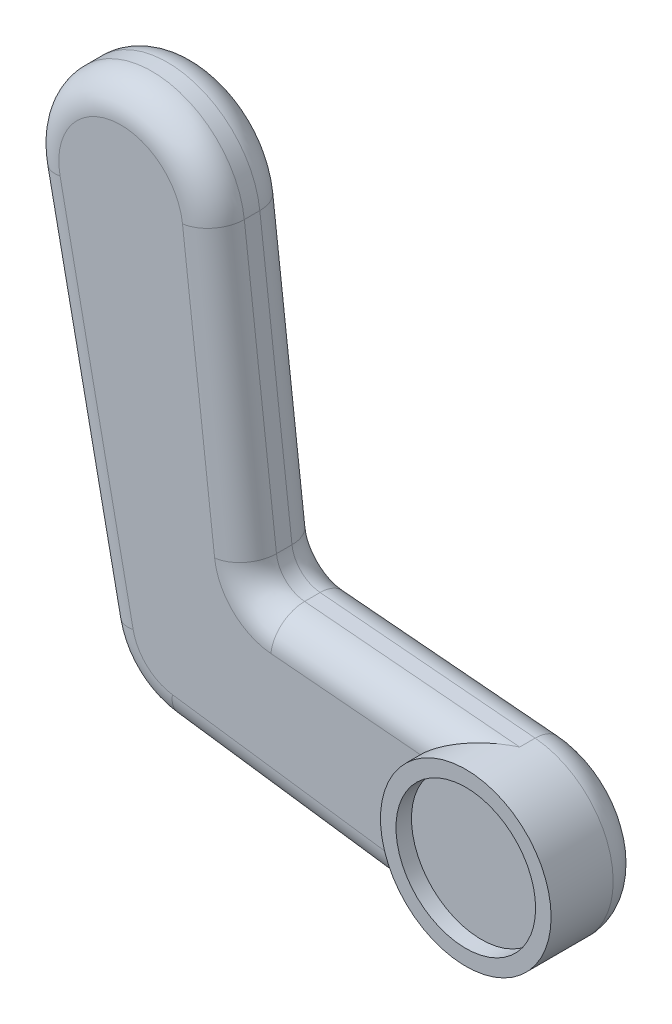
ISO-10303-21;
HEADER;
FILE_DESCRIPTION(('STEP AP214'),'2;1');
FILE_NAME('part.step','',(''),(''),'','','');
FILE_SCHEMA(('AUTOMOTIVE_DESIGN { 1 0 10303 214 1 1 1 1 }'));
ENDSEC;
DATA;
#1=APPLICATION_CONTEXT('core data for automotive mechanical design processes');
#2=APPLICATION_PROTOCOL_DEFINITION('international standard','automotive_design',2000,#1);
#3=PRODUCT_CONTEXT('',#1,'mechanical');
#4=PRODUCT('Part','Part','',(#3));
#5=PRODUCT_RELATED_PRODUCT_CATEGORY('part','',(#4));
#6=PRODUCT_DEFINITION_FORMATION('','',#4);
#7=PRODUCT_DEFINITION_CONTEXT('part definition',#1,'design');
#8=PRODUCT_DEFINITION('design','',#6,#7);
#9=PRODUCT_DEFINITION_SHAPE('','',#8);
#10=(LENGTH_UNIT() NAMED_UNIT(*) SI_UNIT(.MILLI.,.METRE.));
#11=(NAMED_UNIT(*) PLANE_ANGLE_UNIT() SI_UNIT($,.RADIAN.));
#12=(NAMED_UNIT(*) SI_UNIT($,.STERADIAN.) SOLID_ANGLE_UNIT());
#13=UNCERTAINTY_MEASURE_WITH_UNIT(LENGTH_MEASURE(1.E-05),#10,'distance_accuracy_value','');
#14=(GEOMETRIC_REPRESENTATION_CONTEXT(3) GLOBAL_UNCERTAINTY_ASSIGNED_CONTEXT((#13)) GLOBAL_UNIT_ASSIGNED_CONTEXT((#10,
#11,#12)) REPRESENTATION_CONTEXT('',''));
#15=CARTESIAN_POINT('',(0.,0.,0.));
#16=DIRECTION('',(0.,0.,1.));
#17=DIRECTION('',(1.,0.,0.));
#18=AXIS2_PLACEMENT_3D('',#15,#16,#17);
#19=CARTESIAN_POINT('',(0.,0.,5.));
#20=DIRECTION('',(0.,0.,1.));
#21=DIRECTION('',(1.,0.,0.));
#22=AXIS2_PLACEMENT_3D('',#19,#20,#21);
#23=PLANE('',#22);
#24=CARTESIAN_POINT('',(0.,0.,5.));
#25=DIRECTION('',(0.,0.,1.));
#26=DIRECTION('',(1.,0.,0.));
#27=AXIS2_PLACEMENT_3D('',#24,#25,#26);
#28=CIRCLE('',#27,27.5);
#29=CARTESIAN_POINT('',(27.5,0.,5.));
#30=VERTEX_POINT('',#29);
#31=EDGE_CURVE('E202',#30,#30,#28,.T.);
#32=ORIENTED_EDGE('',*,*,#31,.T.);
#33=EDGE_LOOP('',(#32));
#34=FACE_BOUND('',#33,.T.);
#35=CARTESIAN_POINT('',(0.,0.,5.));
#36=DIRECTION('',(0.,0.,1.));
#37=DIRECTION('',(1.,0.,0.));
#38=AXIS2_PLACEMENT_3D('',#35,#36,#37);
#39=CIRCLE('',#38,22.5);
#40=CARTESIAN_POINT('',(22.5,0.,5.));
#41=VERTEX_POINT('',#40);
#42=EDGE_CURVE('E410',#41,#41,#39,.T.);
#43=ORIENTED_EDGE('',*,*,#42,.F.);
#44=EDGE_LOOP('',(#43));
#45=FACE_BOUND('',#44,.T.);
#46=ADVANCED_FACE('F43',(#34,#45),#23,.T.);
#47=CARTESIAN_POINT('',(0.,0.,5.));
#48=DIRECTION('',(0.,0.,-1.));
#49=DIRECTION('',(-1.,0.,0.));
#50=AXIS2_PLACEMENT_3D('',#47,#48,#49);
#51=CYLINDRICAL_SURFACE('',#50,27.5);
#52=ORIENTED_EDGE('',*,*,#31,.F.);
#53=EDGE_LOOP('',(#52));
#54=FACE_BOUND('',#53,.T.);
#55=DIRECTION('',(0.,0.,1.));
#56=VECTOR('',#55,1.);
#57=CARTESIAN_POINT('',(-3.75752842126835,-27.2420810541956,-25.));
#58=LINE('',#57,#56);
#59=CARTESIAN_POINT('',(-3.75752842126835,-27.2420810541956,-15.));
#60=VERTEX_POINT('',#59);
#61=CARTESIAN_POINT('',(-3.75752842126835,-27.2420810541956,-10.));
#62=VERTEX_POINT('',#61);
#63=EDGE_CURVE('E167',#60,#62,#58,.T.);
#64=ORIENTED_EDGE('',*,*,#63,.F.);
#65=CARTESIAN_POINT('',(0.,0.,-15.));
#66=DIRECTION('',(0.,0.,-1.));
#67=DIRECTION('',(-1.,0.,0.));
#68=AXIS2_PLACEMENT_3D('',#65,#66,#67);
#69=CIRCLE('',#68,27.5);
#70=CARTESIAN_POINT('',(2.36498786594932,27.3981173147702,-15.));
#71=VERTEX_POINT('',#70);
#72=EDGE_CURVE('E161',#60,#71,#69,.F.);
#73=ORIENTED_EDGE('',*,*,#72,.T.);
#74=DIRECTION('',(0.,0.,1.));
#75=VECTOR('',#74,1.);
#76=CARTESIAN_POINT('',(2.36498786594932,27.3981173147702,-25.));
#77=LINE('',#76,#75);
#78=CARTESIAN_POINT('',(2.36498786594932,27.3981173147702,-10.));
#79=VERTEX_POINT('',#78);
#80=EDGE_CURVE('E164',#71,#79,#77,.T.);
#81=ORIENTED_EDGE('',*,*,#80,.T.);
#82=CARTESIAN_POINT('',(-19.629619952598,19.2594916993302,0.));
#83=CARTESIAN_POINT('',(-19.4804950674792,19.4114863193802,-2.58608033136355E-06));
#84=CARTESIAN_POINT('',(-19.3296273937898,19.56171758312,-0.00404677025793204));
#85=CARTESIAN_POINT('',(-19.0246798710638,19.8584183152351,-0.0197641265848312));
#86=CARTESIAN_POINT('',(-18.8706006597675,20.0048885178204,-0.0314357977963182));
#87=CARTESIAN_POINT('',(-18.4043644922104,20.4379312799549,-0.0771646805695516));
#88=CARTESIAN_POINT('',(-18.0877302525504,20.7186236464207,-0.121938707129456));
#89=CARTESIAN_POINT('',(-17.4473044336781,21.2606726824992,-0.236170046446091));
#90=CARTESIAN_POINT('',(-17.1235936997473,21.5221700592405,-0.305420169175692));
#91=CARTESIAN_POINT('',(-16.4679549333872,22.0278914852391,-0.465654643117525));
#92=CARTESIAN_POINT('',(-16.1360226259963,22.2721062822743,-0.556650523519821));
#93=CARTESIAN_POINT('',(-15.2841060452578,22.870162939583,-0.811975419196419));
#94=CARTESIAN_POINT('',(-14.7594796373689,23.2118868921289,-0.989353157852216));
#95=CARTESIAN_POINT('',(-13.6984386486137,23.8534600956564,-1.38060895620895));
#96=CARTESIAN_POINT('',(-13.1620201189021,24.1532950641622,-1.59449941032993));
#97=CARTESIAN_POINT('',(-12.0774864503665,24.7135374486886,-2.05312754597173));
#98=CARTESIAN_POINT('',(-11.5293218704649,24.9737088555077,-2.29803512167089));
#99=CARTESIAN_POINT('',(-10.4268344645309,25.4537360430249,-2.81192100432477));
#100=CARTESIAN_POINT('',(-9.87251169094569,25.6735921667954,-3.08089910641672));
#101=CARTESIAN_POINT('',(-8.52623403387546,26.1583250712659,-3.75502093616513));
#102=CARTESIAN_POINT('',(-7.73204755164753,26.4034558146742,-4.16998860381811));
#103=CARTESIAN_POINT('',(-6.13903521035468,26.8186548479547,-5.02802397004821));
#104=CARTESIAN_POINT('',(-5.3402071896426,26.9886847502639,-5.47110590712535));
#105=CARTESIAN_POINT('',(-3.74323211837709,27.2560489443915,-6.37551216845542));
#106=CARTESIAN_POINT('',(-2.94508745977645,27.3535429453934,-6.83679404601559));
#107=CARTESIAN_POINT('',(-1.35072163006649,27.4784369985454,-7.77103237080087));
#108=CARTESIAN_POINT('',(-0.554499618344122,27.5058772178246,-8.24398197088864));
#109=CARTESIAN_POINT('',(0.590107112149595,27.4959013299018,-8.92945263839693));
#110=CARTESIAN_POINT('',(0.940204868909162,27.4861517302499,-9.13987240391389));
#111=CARTESIAN_POINT('',(1.63929848220274,27.453325537943,-9.56115651079276));
#112=CARTESIAN_POINT('',(1.9882948258813,27.4302560383681,-9.77202055606842));
#113=CARTESIAN_POINT('',(2.34612302972221,27.3997408078832,-9.98858202775663));
#114=CARTESIAN_POINT('',(2.35555566963984,27.3989314954957,-9.99429102099557));
#115=CARTESIAN_POINT('',(2.36498786594932,27.3981173147702,-10.));
#116=B_SPLINE_CURVE_WITH_KNOTS('',3,(#82,#83,#84,#85,#86,#87,#88,#89,#90,#91,#92,#93,#94,#95,
#96,#97,#98,#99,#100,#101,#102,#103,#104,#105,#106,#107,#108,#109,#110,#111,#112,#113,#114,
#115),.UNSPECIFIED.,.F.,.F.,(4,2,2,2,2,2,2,2,2,2,2,2,2,2,2,2,4),(0.,0.638680835833969,
1.27723602980536,2.55230274418055,3.81682480604324,5.08201878684361,7.03126612892686,
8.98117647313759,10.9422709427457,12.9033487231864,15.6862805099955,18.4706331422623,
21.2488369093158,24.0254473639889,25.2510396575953,26.475979902987,26.5091461541338),.UNSPECIFIED.);
#117=CARTESIAN_POINT('',(-19.629619952598,19.2594916993302,0.));
#118=VERTEX_POINT('',#117);
#119=EDGE_CURVE('E11',#79,#118,#116,.F.);
#120=ORIENTED_EDGE('',*,*,#119,.T.);
#121=CARTESIAN_POINT('',(0.,0.,0.));
#122=DIRECTION('',(0.,0.,1.));
#123=DIRECTION('',(1.,0.,0.));
#124=AXIS2_PLACEMENT_3D('',#121,#122,#123);
#125=CIRCLE('',#124,27.5);
#126=CARTESIAN_POINT('',(-23.4054019921401,-14.4373528593826,0.));
#127=VERTEX_POINT('',#126);
#128=EDGE_CURVE('E413',#118,#127,#125,.T.);
#129=ORIENTED_EDGE('',*,*,#128,.T.);
#130=CARTESIAN_POINT('',(-23.4054019921401,-14.4373528593826,0.));
#131=CARTESIAN_POINT('',(-23.2936154416342,-14.6185829976378,-2.58608033261556E-06));
#132=CARTESIAN_POINT('',(-23.1797390498459,-14.7984792315138,-0.00404677025794965));
#133=CARTESIAN_POINT('',(-22.9480211757239,-15.1553141273235,-0.0197641265849107));
#134=CARTESIAN_POINT('',(-22.8301804778133,-15.3322533641116,-0.0314357977964434));
#135=CARTESIAN_POINT('',(-22.4713496547863,-15.8577461216477,-0.0771646805698546));
#136=CARTESIAN_POINT('',(-22.2246918527838,-16.201556207348,-0.121938707129933));
#137=CARTESIAN_POINT('',(-21.7201169522785,-16.8719042936225,-0.236170046446767));
#138=CARTESIAN_POINT('',(-21.462309836005,-17.1985616188161,-0.305420169176294));
#139=CARTESIAN_POINT('',(-20.9348590868465,-17.8368500018198,-0.46565464311789));
#140=CARTESIAN_POINT('',(-20.6652092372773,-18.1484729830125,-0.556650523520024));
#141=CARTESIAN_POINT('',(-19.9667843229935,-18.9202477331779,-0.811975419196239));
#142=CARTESIAN_POINT('',(-19.5308002615594,-19.3696095314791,-0.989353157851801));
#143=CARTESIAN_POINT('',(-18.6380684257909,-20.230105914217,-1.38060895620798));
#144=CARTESIAN_POINT('',(-18.1813136394846,-20.6412274443541,-1.59449941032864));
#145=CARTESIAN_POINT('',(-17.2476712602921,-21.4276094859743,-2.05312754597027));
#146=CARTESIAN_POINT('',(-16.7706832179142,-21.8026507837193,-2.29803512166965));
#147=CARTESIAN_POINT('',(-15.8017787876449,-22.5147805373504,-2.81192100432412));
#148=CARTESIAN_POINT('',(-15.3098625268302,-22.8518693161929,-3.08089910641645));
#149=CARTESIAN_POINT('',(-14.1042552604534,-23.622544758819,-3.75502093616537));
#150=CARTESIAN_POINT('',(-13.3840177240302,-24.0373689879161,-4.16998860381835));
#151=CARTESIAN_POINT('',(-11.9224051950821,-24.7948433254172,-5.02802397005016));
#152=CARTESIAN_POINT('',(-11.1810195984231,-25.1374564766831,-5.471105907129));
#153=CARTESIAN_POINT('',(-9.68282319250998,-25.7516392832319,-6.37551216845531));
#154=CARTESIAN_POINT('',(-8.92605006338966,-26.023364157561,-6.83679404600999));
#155=CARTESIAN_POINT('',(-7.39886610641632,-26.4980325523295,-7.77103237080849));
#156=CARTESIAN_POINT('',(-6.62846334875328,-26.701015429813,-8.24398197091494));
#157=CARTESIAN_POINT('',(-5.51003462187162,-26.9446160635711,-8.92945263838555));
#158=CARTESIAN_POINT('',(-5.16646136405255,-27.012593342875,-9.13987240388232));
#159=CARTESIAN_POINT('',(-4.47743983637665,-27.1353075368178,-9.56115651082458));
#160=CARTESIAN_POINT('',(-4.13199266132626,-27.1900514764474,-9.77202055618375));
#161=CARTESIAN_POINT('',(-3.77628473338466,-27.2394890411362,-9.98858202776281));
#162=CARTESIAN_POINT('',(-3.76690689976356,-27.2407874705588,-9.99429102099873));
#163=CARTESIAN_POINT('',(-3.75752842126835,-27.2420810541955,-10.));
#164=B_SPLINE_CURVE_WITH_KNOTS('',3,(#130,#131,#132,#133,#134,#135,#136,#137,#138,#139,#140,
#141,#142,#143,#144,#145,#146,#147,#148,#149,#150,#151,#152,#153,#154,#155,#156,#157,#158,#159,
#160,#161,#162,#163),.UNSPECIFIED.,.F.,.F.,(4,2,2,2,2,2,2,2,2,2,2,2,2,2,2,2,4),(0.,
0.638680835835257,1.27723602980794,2.55230274418566,3.81682480604578,5.08201878684361,
7.03126612892458,8.98117647313294,10.9422709427432,12.9033487231863,15.686280509998,
18.4706331422666,21.2488369093176,24.0254473639888,25.2510396575952,26.4759799029871,
26.5091461541338),.UNSPECIFIED.);
#165=EDGE_CURVE('E53',#127,#62,#164,.T.);
#166=ORIENTED_EDGE('',*,*,#165,.T.);
#167=EDGE_LOOP('',(#64,#73,#81,#120,#129,#166));
#168=FACE_BOUND('',#167,.T.);
#169=ADVANCED_FACE('F163',(#54,#168),#51,.T.);
#170=CARTESIAN_POINT('',(0.,0.,5.));
#171=DIRECTION('',(0.,0.,-1.));
#172=DIRECTION('',(-1.,0.,0.));
#173=AXIS2_PLACEMENT_3D('',#170,#171,#172);
#174=CYLINDRICAL_SURFACE('',#173,22.5);
#175=ORIENTED_EDGE('',*,*,#42,.T.);
#176=EDGE_LOOP('',(#175));
#177=FACE_BOUND('',#176,.T.);
#178=CARTESIAN_POINT('',(0.,0.,0.));
#179=DIRECTION('',(0.,0.,1.));
#180=DIRECTION('',(1.,0.,0.));
#181=AXIS2_PLACEMENT_3D('',#178,#179,#180);
#182=CIRCLE('',#181,22.5);
#183=CARTESIAN_POINT('',(22.5,0.,0.));
#184=VERTEX_POINT('',#183);
#185=EDGE_CURVE('E409',#184,#184,#182,.T.);
#186=ORIENTED_EDGE('',*,*,#185,.F.);
#187=EDGE_LOOP('',(#186));
#188=FACE_BOUND('',#187,.T.);
#189=ADVANCED_FACE('F325',(#177,#188),#174,.F.);
#190=CARTESIAN_POINT('',(0.,0.,0.));
#191=DIRECTION('',(0.,0.,-1.));
#192=DIRECTION('',(-1.,0.,0.));
#193=AXIS2_PLACEMENT_3D('',#190,#191,#192);
#194=PLANE('',#193);
#195=ORIENTED_EDGE('',*,*,#185,.T.);
#196=EDGE_LOOP('',(#195));
#197=FACE_BOUND('',#196,.T.);
#198=ADVANCED_FACE('F332',(#197),#194,.F.);
#199=CARTESIAN_POINT('',(-115.920026502103,-23.7730817951904,-25.));
#200=DIRECTION('',(-0.979611657872959,-0.200900472272695,0.));
#201=DIRECTION('',(0.200900472272695,-0.979611657872959,0.));
#202=AXIS2_PLACEMENT_3D('',#199,#200,#201);
#203=PLANE('',#202);
#204=DIRECTION('',(0.,0.,1.));
#205=VECTOR('',#204,1.);
#206=CARTESIAN_POINT('',(-122.006316958186,5.90430530366279,-25.));
#207=LINE('',#206,#205);
#208=CARTESIAN_POINT('',(-122.006316958186,5.90430530366279,-15.));
#209=VERTEX_POINT('',#208);
#210=CARTESIAN_POINT('',(-122.006316958186,5.90430530366279,-10.));
#211=VERTEX_POINT('',#210);
#212=EDGE_CURVE('E249',#209,#211,#207,.T.);
#213=ORIENTED_EDGE('',*,*,#212,.T.);
#214=DIRECTION('',(0.200900472272695,-0.979611657872959,0.));
#215=VECTOR('',#214,1.);
#216=CARTESIAN_POINT('',(-145.558232534352,120.745902252901,-10.));
#217=LINE('',#216,#215);
#218=CARTESIAN_POINT('',(-145.558232534352,120.745902252901,-10.));
#219=VERTEX_POINT('',#218);
#220=EDGE_CURVE('E272',#211,#219,#217,.F.);
#221=ORIENTED_EDGE('',*,*,#220,.T.);
#222=DIRECTION('',(0.,0.,1.));
#223=VECTOR('',#222,1.);
#224=CARTESIAN_POINT('',(-145.558232534352,120.745902252901,-25.));
#225=LINE('',#224,#223);
#226=CARTESIAN_POINT('',(-145.558232534352,120.745902252901,-15.));
#227=VERTEX_POINT('',#226);
#228=EDGE_CURVE('E406',#227,#219,#225,.T.);
#229=ORIENTED_EDGE('',*,*,#228,.F.);
#230=DIRECTION('',(0.200900472272695,-0.979611657872959,0.));
#231=VECTOR('',#230,1.);
#232=CARTESIAN_POINT('',(-115.920026502103,-23.7730817951904,-15.));
#233=LINE('',#232,#231);
#234=EDGE_CURVE('E223',#227,#209,#233,.T.);
#235=ORIENTED_EDGE('',*,*,#234,.T.);
#236=EDGE_LOOP('',(#213,#221,#229,#235));
#237=FACE_BOUND('',#236,.T.);
#238=ADVANCED_FACE('F334',(#237),#203,.T.);
#239=CARTESIAN_POINT('',(-116.169882798164,126.772916421082,-25.));
#240=DIRECTION('',(0.,0.,1.));
#241=DIRECTION('',(1.,0.,0.));
#242=AXIS2_PLACEMENT_3D('',#239,#240,#241);
#243=CYLINDRICAL_SURFACE('',#242,30.);
#244=ORIENTED_EDGE('',*,*,#228,.T.);
#245=CARTESIAN_POINT('',(-116.169882798164,126.772916421082,-10.));
#246=DIRECTION('',(0.,0.,-1.));
#247=DIRECTION('',(-1.,0.,0.));
#248=AXIS2_PLACEMENT_3D('',#245,#246,#247);
#249=CIRCLE('',#248,30.);
#250=CARTESIAN_POINT('',(-86.3750803237855,130.275736072847,-10.));
#251=VERTEX_POINT('',#250);
#252=EDGE_CURVE('E268',#219,#251,#249,.T.);
#253=ORIENTED_EDGE('',*,*,#252,.T.);
#254=DIRECTION('',(0.,0.,1.));
#255=VECTOR('',#254,1.);
#256=CARTESIAN_POINT('',(-86.3750803237855,130.275736072847,-25.));
#257=LINE('',#256,#255);
#258=CARTESIAN_POINT('',(-86.3750803237855,130.275736072847,-15.));
#259=VERTEX_POINT('',#258);
#260=EDGE_CURVE('E182',#259,#251,#257,.T.);
#261=ORIENTED_EDGE('',*,*,#260,.F.);
#262=CARTESIAN_POINT('',(-116.169882798164,126.772916421082,-15.));
#263=DIRECTION('',(0.,0.,-1.));
#264=DIRECTION('',(-1.,0.,0.));
#265=AXIS2_PLACEMENT_3D('',#262,#263,#264);
#266=CIRCLE('',#265,30.);
#267=EDGE_CURVE('E221',#259,#227,#266,.F.);
#268=ORIENTED_EDGE('',*,*,#267,.T.);
#269=EDGE_LOOP('',(#244,#253,#261,#268));
#270=FACE_BOUND('',#269,.T.);
#271=ADVANCED_FACE('F337',(#270),#243,.T.);
#272=CARTESIAN_POINT('',(-70.0904867381572,-8.2401732503285,-25.));
#273=DIRECTION('',(-0.993160082479271,-0.116760655058834,0.));
#274=DIRECTION('',(0.116760655058834,-0.993160082479271,0.));
#275=AXIS2_PLACEMENT_3D('',#272,#273,#274);
#276=PLANE('',#275);
#277=ORIENTED_EDGE('',*,*,#260,.T.);
#278=DIRECTION('',(0.116760655058834,-0.993160082479271,0.));
#279=VECTOR('',#278,1.);
#280=CARTESIAN_POINT('',(-70.0904867381572,-8.2401732503285,-10.));
#281=LINE('',#280,#279);
#282=CARTESIAN_POINT('',(-76.0176946469568,42.176350129136,-10.));
#283=VERTEX_POINT('',#282);
#284=EDGE_CURVE('E61',#251,#283,#281,.T.);
#285=ORIENTED_EDGE('',*,*,#284,.T.);
#286=DIRECTION('',(0.,0.,1.));
#287=VECTOR('',#286,1.);
#288=CARTESIAN_POINT('',(-76.0176946469568,42.176350129136,-25.));
#289=LINE('',#288,#287);
#290=CARTESIAN_POINT('',(-76.0176946469568,42.176350129136,-15.));
#291=VERTEX_POINT('',#290);
#292=EDGE_CURVE('E225',#283,#291,#289,.F.);
#293=ORIENTED_EDGE('',*,*,#292,.T.);
#294=DIRECTION('',(0.116760655058834,-0.993160082479271,0.));
#295=VECTOR('',#294,1.);
#296=CARTESIAN_POINT('',(-86.3750803237855,130.275736072847,-15.));
#297=LINE('',#296,#295);
#298=EDGE_CURVE('E227',#291,#259,#297,.F.);
#299=ORIENTED_EDGE('',*,*,#298,.T.);
#300=EDGE_LOOP('',(#277,#285,#293,#299));
#301=FACE_BOUND('',#300,.T.);
#302=ADVANCED_FACE('F341',(#301),#276,.F.);
#303=CARTESIAN_POINT('',(2.36498786594932,27.3981173147702,-25.));
#304=DIRECTION('',(0.0859995587617934,0.996295175082554,0.));
#305=DIRECTION('',(-0.996295175082554,0.0859995587617934,0.));
#306=AXIS2_PLACEMENT_3D('',#303,#304,#305);
#307=PLANE('',#306);
#308=DIRECTION('',(0.,0.,1.));
#309=VECTOR('',#308,1.);
#310=CARTESIAN_POINT('',(-66.9460894097821,33.3810049288988,-25.));
#311=LINE('',#310,#309);
#312=CARTESIAN_POINT('',(-66.9460894097821,33.3810049288988,-15.));
#313=VERTEX_POINT('',#312);
#314=CARTESIAN_POINT('',(-66.9460894097821,33.3810049288988,-10.));
#315=VERTEX_POINT('',#314);
#316=EDGE_CURVE('E197',#313,#315,#311,.T.);
#317=ORIENTED_EDGE('',*,*,#316,.T.);
#318=DIRECTION('',(-0.996295175082554,0.0859995587617934,0.));
#319=VECTOR('',#318,1.);
#320=CARTESIAN_POINT('',(2.36498786594932,27.3981173147702,-10.));
#321=LINE('',#320,#319);
#322=EDGE_CURVE('E181',#315,#79,#321,.F.);
#323=ORIENTED_EDGE('',*,*,#322,.T.);
#324=ORIENTED_EDGE('',*,*,#80,.F.);
#325=DIRECTION('',(-0.996295175082554,0.0859995587617934,0.));
#326=VECTOR('',#325,1.);
#327=CARTESIAN_POINT('',(2.36498786594932,27.3981173147702,-15.));
#328=LINE('',#327,#326);
#329=EDGE_CURVE('E179',#71,#313,#328,.T.);
#330=ORIENTED_EDGE('',*,*,#329,.T.);
#331=EDGE_LOOP('',(#317,#323,#324,#330));
#332=FACE_BOUND('',#331,.T.);
#333=ADVANCED_FACE('F177',(#332),#307,.T.);
#334=CARTESIAN_POINT('',(-3.75752842126835,-27.2420810541955,-25.));
#335=DIRECTION('',(0.136637397137031,0.990621129243475,0.));
#336=DIRECTION('',(-0.990621129243475,0.136637397137031,0.));
#337=AXIS2_PLACEMENT_3D('',#334,#335,#336);
#338=PLANE('',#337);
#339=ORIENTED_EDGE('',*,*,#63,.T.);
#340=DIRECTION('',(-0.990621129243475,0.136637397137031,0.));
#341=VECTOR('',#340,1.);
#342=CARTESIAN_POINT('',(-3.75752842126835,-27.2420810541955,-10.));
#343=LINE('',#342,#341);
#344=CARTESIAN_POINT('',(-100.931960439788,-13.8387111206067,-10.));
#345=VERTEX_POINT('',#344);
#346=EDGE_CURVE('E229',#62,#345,#343,.T.);
#347=ORIENTED_EDGE('',*,*,#346,.T.);
#348=DIRECTION('',(0.,0.,1.));
#349=VECTOR('',#348,1.);
#350=CARTESIAN_POINT('',(-100.931960439788,-13.8387111206067,-25.));
#351=LINE('',#350,#349);
#352=CARTESIAN_POINT('',(-100.931960439788,-13.8387111206067,-15.));
#353=VERTEX_POINT('',#352);
#354=EDGE_CURVE('E398',#353,#345,#351,.T.);
#355=ORIENTED_EDGE('',*,*,#354,.F.);
#356=DIRECTION('',(-0.990621129243475,0.136637397137031,0.));
#357=VECTOR('',#356,1.);
#358=CARTESIAN_POINT('',(-3.75752842126835,-27.2420810541955,-15.));
#359=LINE('',#358,#357);
#360=EDGE_CURVE('E172',#353,#60,#359,.F.);
#361=ORIENTED_EDGE('',*,*,#360,.T.);
#362=EDGE_LOOP('',(#339,#347,#355,#361));
#363=FACE_BOUND('',#362,.T.);
#364=ADVANCED_FACE('F347',(#363),#338,.F.);
#365=CARTESIAN_POINT('',(-97.5160255113618,10.9268171104802,-25.));
#366=DIRECTION('',(0.,0.,1.));
#367=DIRECTION('',(1.,0.,0.));
#368=AXIS2_PLACEMENT_3D('',#365,#366,#367);
#369=CYLINDRICAL_SURFACE('',#368,25.);
#370=ORIENTED_EDGE('',*,*,#354,.T.);
#371=CARTESIAN_POINT('',(-97.5160255113618,10.9268171104802,-10.));
#372=DIRECTION('',(0.,0.,-1.));
#373=DIRECTION('',(-1.,0.,0.));
#374=AXIS2_PLACEMENT_3D('',#371,#372,#373);
#375=CIRCLE('',#374,25.);
#376=EDGE_CURVE('E266',#345,#211,#375,.T.);
#377=ORIENTED_EDGE('',*,*,#376,.T.);
#378=ORIENTED_EDGE('',*,*,#212,.F.);
#379=CARTESIAN_POINT('',(-97.5160255113618,10.9268171104802,-15.));
#380=DIRECTION('',(0.,0.,-1.));
#381=DIRECTION('',(-1.,0.,0.));
#382=AXIS2_PLACEMENT_3D('',#379,#380,#381);
#383=CIRCLE('',#382,25.);
#384=EDGE_CURVE('E219',#209,#353,#383,.F.);
#385=ORIENTED_EDGE('',*,*,#384,.T.);
#386=EDGE_LOOP('',(#370,#377,#378,#385));
#387=FACE_BOUND('',#386,.T.);
#388=ADVANCED_FACE('F350',(#387),#369,.T.);
#389=CARTESIAN_POINT('',(0.,0.,-25.));
#390=DIRECTION('',(0.,0.,-1.));
#391=DIRECTION('',(-1.,0.,0.));
#392=AXIS2_PLACEMENT_3D('',#389,#390,#391);
#393=PLANE('',#392);
#394=DIRECTION('',(-0.996295175082554,0.0859995587617934,0.));
#395=VECTOR('',#394,1.);
#396=CARTESIAN_POINT('',(1.50499227833139,17.4351655639447,-25.));
#397=LINE('',#396,#395);
#398=CARTESIAN_POINT('',(-67.8060849974,23.4180531780733,-25.));
#399=VERTEX_POINT('',#398);
#400=CARTESIAN_POINT('',(1.50499227833139,17.4351655639447,-25.));
#401=VERTEX_POINT('',#400);
#402=EDGE_CURVE('E209',#399,#401,#397,.F.);
#403=ORIENTED_EDGE('',*,*,#402,.T.);
#404=CARTESIAN_POINT('',(0.,0.,-25.));
#405=DIRECTION('',(0.,0.,-1.));
#406=DIRECTION('',(-1.,0.,0.));
#407=AXIS2_PLACEMENT_3D('',#404,#405,#406);
#408=CIRCLE('',#407,17.5);
#409=CARTESIAN_POINT('',(-2.39115444989804,-17.3358697617608,-25.));
#410=VERTEX_POINT('',#409);
#411=EDGE_CURVE('E173',#401,#410,#408,.T.);
#412=ORIENTED_EDGE('',*,*,#411,.T.);
#413=DIRECTION('',(-0.990621129243475,0.136637397137031,0.));
#414=VECTOR('',#413,1.);
#415=CARTESIAN_POINT('',(-99.5655864684173,-3.93249982817195,-25.));
#416=LINE('',#415,#414);
#417=CARTESIAN_POINT('',(-99.5655864684173,-3.93249982817196,-25.));
#418=VERTEX_POINT('',#417);
#419=EDGE_CURVE('E215',#410,#418,#416,.T.);
#420=ORIENTED_EDGE('',*,*,#419,.T.);
#421=CARTESIAN_POINT('',(-97.5160255113618,10.9268171104802,-25.));
#422=DIRECTION('',(0.,0.,-1.));
#423=DIRECTION('',(-1.,0.,0.));
#424=AXIS2_PLACEMENT_3D('',#421,#422,#423);
#425=CIRCLE('',#424,15.);
#426=CARTESIAN_POINT('',(-112.210200379456,7.91331002638974,-25.));
#427=VERTEX_POINT('',#426);
#428=EDGE_CURVE('E213',#418,#427,#425,.T.);
#429=ORIENTED_EDGE('',*,*,#428,.T.);
#430=DIRECTION('',(0.200900472272695,-0.979611657872959,0.));
#431=VECTOR('',#430,1.);
#432=CARTESIAN_POINT('',(-106.123909923374,-21.7640770724634,-25.));
#433=LINE('',#432,#431);
#434=CARTESIAN_POINT('',(-135.762115955623,122.754906975628,-25.));
#435=VERTEX_POINT('',#434);
#436=EDGE_CURVE('E211',#427,#435,#433,.F.);
#437=ORIENTED_EDGE('',*,*,#436,.T.);
#438=CARTESIAN_POINT('',(-116.169882798164,126.772916421082,-25.));
#439=DIRECTION('',(0.,0.,-1.));
#440=DIRECTION('',(-1.,0.,0.));
#441=AXIS2_PLACEMENT_3D('',#438,#439,#440);
#442=CIRCLE('',#441,20.);
#443=CARTESIAN_POINT('',(-96.3066811485782,129.108129522259,-25.));
#444=VERTEX_POINT('',#443);
#445=EDGE_CURVE('E207',#435,#444,#442,.T.);
#446=ORIENTED_EDGE('',*,*,#445,.T.);
#447=DIRECTION('',(0.116760655058834,-0.993160082479271,0.));
#448=VECTOR('',#447,1.);
#449=CARTESIAN_POINT('',(-84.9976751295848,32.9143102522091,-25.));
#450=LINE('',#449,#448);
#451=CARTESIAN_POINT('',(-85.9492954717496,41.0087435785477,-25.));
#452=VERTEX_POINT('',#451);
#453=EDGE_CURVE('E200',#444,#452,#450,.T.);
#454=ORIENTED_EDGE('',*,*,#453,.T.);
#455=CARTESIAN_POINT('',(-66.0860938221641,43.3439566797243,-25.));
#456=DIRECTION('',(0.,0.,-1.));
#457=DIRECTION('',(-1.,0.,0.));
#458=AXIS2_PLACEMENT_3D('',#455,#456,#457);
#459=CIRCLE('',#458,20.);
#460=EDGE_CURVE('E196',#399,#452,#459,.T.);
#461=ORIENTED_EDGE('',*,*,#460,.F.);
#462=EDGE_LOOP('',(#403,#412,#420,#429,#437,#446,#454,#461));
#463=FACE_BOUND('',#462,.T.);
#464=ADVANCED_FACE('F354',(#463),#393,.T.);
#465=CARTESIAN_POINT('',(-97.5160255113618,10.9268171104802,0.));
#466=DIRECTION('',(0.,0.,-1.));
#467=DIRECTION('',(-1.,0.,0.));
#468=AXIS2_PLACEMENT_3D('',#465,#466,#467);
#469=CIRCLE('',#468,15.);
#470=CARTESIAN_POINT('',(-112.210200379456,7.91331002638974,0.));
#471=VERTEX_POINT('',#470);
#472=CARTESIAN_POINT('',(-99.5655864684173,-3.93249982817196,0.));
#473=VERTEX_POINT('',#472);
#474=EDGE_CURVE('E262',#471,#473,#469,.F.);
#475=ORIENTED_EDGE('',*,*,#474,.T.);
#476=DIRECTION('',(-0.990621129243475,0.136637397137031,0.));
#477=VECTOR('',#476,1.);
#478=CARTESIAN_POINT('',(-2.39115444989804,-17.3358697617608,0.));
#479=LINE('',#478,#477);
#480=EDGE_CURVE('E264',#473,#127,#479,.F.);
#481=ORIENTED_EDGE('',*,*,#480,.T.);
#482=ORIENTED_EDGE('',*,*,#128,.F.);
#483=DIRECTION('',(-0.996295175082554,0.0859995587617934,0.));
#484=VECTOR('',#483,1.);
#485=CARTESIAN_POINT('',(-67.8060849974,23.4180531780733,0.));
#486=LINE('',#485,#484);
#487=CARTESIAN_POINT('',(-67.8060849974,23.4180531780733,0.));
#488=VERTEX_POINT('',#487);
#489=EDGE_CURVE('E256',#118,#488,#486,.T.);
#490=ORIENTED_EDGE('',*,*,#489,.T.);
#491=CARTESIAN_POINT('',(-66.0860938221641,43.3439566797243,0.));
#492=DIRECTION('',(0.,0.,-1.));
#493=DIRECTION('',(-1.,0.,0.));
#494=AXIS2_PLACEMENT_3D('',#491,#492,#493);
#495=CIRCLE('',#494,20.);
#496=CARTESIAN_POINT('',(-85.9492954717496,41.0087435785476,0.));
#497=VERTEX_POINT('',#496);
#498=EDGE_CURVE('E254',#488,#497,#495,.T.);
#499=ORIENTED_EDGE('',*,*,#498,.T.);
#500=DIRECTION('',(0.116760655058834,-0.993160082479271,0.));
#501=VECTOR('',#500,1.);
#502=CARTESIAN_POINT('',(-80.0220875629499,-9.40777980091684,0.));
#503=LINE('',#502,#501);
#504=CARTESIAN_POINT('',(-96.3066811485782,129.108129522259,0.));
#505=VERTEX_POINT('',#504);
#506=EDGE_CURVE('E252',#497,#505,#503,.F.);
#507=ORIENTED_EDGE('',*,*,#506,.T.);
#508=CARTESIAN_POINT('',(-116.169882798164,126.772916421082,0.));
#509=DIRECTION('',(0.,0.,-1.));
#510=DIRECTION('',(-1.,0.,0.));
#511=AXIS2_PLACEMENT_3D('',#508,#509,#510);
#512=CIRCLE('',#511,20.);
#513=CARTESIAN_POINT('',(-135.762115955623,122.754906975628,0.));
#514=VERTEX_POINT('',#513);
#515=EDGE_CURVE('E258',#505,#514,#512,.F.);
#516=ORIENTED_EDGE('',*,*,#515,.T.);
#517=DIRECTION('',(0.200900472272695,-0.979611657872959,0.));
#518=VECTOR('',#517,1.);
#519=CARTESIAN_POINT('',(-112.210200379456,7.91331002638974,0.));
#520=LINE('',#519,#518);
#521=EDGE_CURVE('E260',#514,#471,#520,.T.);
#522=ORIENTED_EDGE('',*,*,#521,.T.);
#523=EDGE_LOOP('',(#475,#481,#482,#490,#499,#507,#516,#522));
#524=FACE_BOUND('',#523,.T.);
#525=ADVANCED_FACE('F356',(#524),#194,.F.);
#526=CARTESIAN_POINT('',(-106.123909923374,-21.7640770724634,-15.));
#527=DIRECTION('',(0.200900472272695,-0.979611657872959,0.));
#528=DIRECTION('',(0.979611657872959,0.200900472272695,0.));
#529=AXIS2_PLACEMENT_3D('',#526,#527,#528);
#530=CYLINDRICAL_SURFACE('',#529,10.);
#531=CARTESIAN_POINT('',(-135.762115955623,122.754906975628,-15.));
#532=DIRECTION('',(-0.200900472272696,0.979611657872959,0.));
#533=DIRECTION('',(-0.979611657872959,-0.200900472272696,0.));
#534=AXIS2_PLACEMENT_3D('',#531,#532,#533);
#535=CIRCLE('',#534,10.);
#536=EDGE_CURVE('E243',#435,#227,#535,.T.);
#537=ORIENTED_EDGE('',*,*,#536,.F.);
#538=ORIENTED_EDGE('',*,*,#436,.F.);
#539=CARTESIAN_POINT('',(-112.210200379456,7.91331002638974,-15.));
#540=DIRECTION('',(0.200900472272695,-0.97961165787296,0.));
#541=DIRECTION('',(0.97961165787296,0.200900472272695,0.));
#542=AXIS2_PLACEMENT_3D('',#539,#540,#541);
#543=CIRCLE('',#542,10.);
#544=EDGE_CURVE('E246',#209,#427,#543,.T.);
#545=ORIENTED_EDGE('',*,*,#544,.F.);
#546=ORIENTED_EDGE('',*,*,#234,.F.);
#547=EDGE_LOOP('',(#537,#538,#545,#546));
#548=FACE_BOUND('',#547,.T.);
#549=ADVANCED_FACE('F296',(#548),#530,.T.);
#550=CARTESIAN_POINT('',(-97.5160255113618,10.9268171104802,-15.));
#551=DIRECTION('',(0.,0.,-1.));
#552=DIRECTION('',(-1.,0.,0.));
#553=AXIS2_PLACEMENT_3D('',#550,#551,#552);
#554=TOROIDAL_SURFACE('',#553,15.,10.);
#555=ORIENTED_EDGE('',*,*,#544,.T.);
#556=ORIENTED_EDGE('',*,*,#428,.F.);
#557=CARTESIAN_POINT('',(-99.5655864684173,-3.93249982817196,-15.));
#558=DIRECTION('',(0.990621129243475,-0.136637397137031,0.));
#559=DIRECTION('',(0.136637397137031,0.990621129243475,0.));
#560=AXIS2_PLACEMENT_3D('',#557,#558,#559);
#561=CIRCLE('',#560,10.);
#562=EDGE_CURVE('E240',#353,#418,#561,.T.);
#563=ORIENTED_EDGE('',*,*,#562,.F.);
#564=ORIENTED_EDGE('',*,*,#384,.F.);
#565=EDGE_LOOP('',(#555,#556,#563,#564));
#566=FACE_BOUND('',#565,.T.);
#567=ADVANCED_FACE('F442',(#566),#554,.T.);
#568=CARTESIAN_POINT('',(-116.169882798164,126.772916421082,-15.));
#569=DIRECTION('',(0.,0.,-1.));
#570=DIRECTION('',(-1.,0.,0.));
#571=AXIS2_PLACEMENT_3D('',#568,#569,#570);
#572=TOROIDAL_SURFACE('',#571,20.,10.);
#573=ORIENTED_EDGE('',*,*,#536,.T.);
#574=ORIENTED_EDGE('',*,*,#267,.F.);
#575=CARTESIAN_POINT('',(-96.3066811485782,129.108129522259,-15.));
#576=DIRECTION('',(0.116760655058834,-0.993160082479271,0.));
#577=DIRECTION('',(0.993160082479271,0.116760655058834,0.));
#578=AXIS2_PLACEMENT_3D('',#575,#576,#577);
#579=CIRCLE('',#578,10.);
#580=EDGE_CURVE('E237',#444,#259,#579,.T.);
#581=ORIENTED_EDGE('',*,*,#580,.F.);
#582=ORIENTED_EDGE('',*,*,#445,.F.);
#583=EDGE_LOOP('',(#573,#574,#581,#582));
#584=FACE_BOUND('',#583,.T.);
#585=ADVANCED_FACE('F430',(#584),#572,.T.);
#586=CARTESIAN_POINT('',(-2.39115444989804,-17.3358697617608,-15.));
#587=DIRECTION('',(0.990621129243475,-0.136637397137031,0.));
#588=DIRECTION('',(0.136637397137031,0.990621129243475,0.));
#589=AXIS2_PLACEMENT_3D('',#586,#587,#588);
#590=CYLINDRICAL_SURFACE('',#589,10.);
#591=ORIENTED_EDGE('',*,*,#562,.T.);
#592=ORIENTED_EDGE('',*,*,#419,.F.);
#593=CARTESIAN_POINT('',(-2.39115444989804,-17.3358697617608,-15.));
#594=DIRECTION('',(0.990621129243475,-0.136637397137031,0.));
#595=DIRECTION('',(0.136637397137031,0.990621129243475,0.));
#596=AXIS2_PLACEMENT_3D('',#593,#594,#595);
#597=CIRCLE('',#596,10.);
#598=EDGE_CURVE('E235',#60,#410,#597,.T.);
#599=ORIENTED_EDGE('',*,*,#598,.F.);
#600=ORIENTED_EDGE('',*,*,#360,.F.);
#601=EDGE_LOOP('',(#591,#592,#599,#600));
#602=FACE_BOUND('',#601,.T.);
#603=ADVANCED_FACE('F445',(#602),#590,.T.);
#604=CARTESIAN_POINT('',(-66.0860938221641,43.3439566797243,-25.));
#605=DIRECTION('',(0.,0.,1.));
#606=DIRECTION('',(1.,0.,0.));
#607=AXIS2_PLACEMENT_3D('',#604,#605,#606);
#608=CYLINDRICAL_SURFACE('',#607,10.);
#609=ORIENTED_EDGE('',*,*,#292,.F.);
#610=CARTESIAN_POINT('',(-66.0860938221641,43.3439566797243,-10.));
#611=DIRECTION('',(0.,0.,-1.));
#612=DIRECTION('',(-1.,0.,0.));
#613=AXIS2_PLACEMENT_3D('',#610,#611,#612);
#614=CIRCLE('',#613,10.);
#615=EDGE_CURVE('E68',#283,#315,#614,.F.);
#616=ORIENTED_EDGE('',*,*,#615,.T.);
#617=ORIENTED_EDGE('',*,*,#316,.F.);
#618=CARTESIAN_POINT('',(-66.0860938221641,43.3439566797243,-15.));
#619=DIRECTION('',(0.,0.,-1.));
#620=DIRECTION('',(-1.,0.,0.));
#621=AXIS2_PLACEMENT_3D('',#618,#619,#620);
#622=CIRCLE('',#621,10.);
#623=EDGE_CURVE('E233',#291,#313,#622,.F.);
#624=ORIENTED_EDGE('',*,*,#623,.F.);
#625=EDGE_LOOP('',(#609,#616,#617,#624));
#626=FACE_BOUND('',#625,.T.);
#627=ADVANCED_FACE('F369',(#626),#608,.F.);
#628=CARTESIAN_POINT('',(-80.0220875629499,-9.40777980091684,-15.));
#629=DIRECTION('',(-0.116760655058834,0.993160082479271,0.));
#630=DIRECTION('',(-0.993160082479271,-0.116760655058834,0.));
#631=AXIS2_PLACEMENT_3D('',#628,#629,#630);
#632=CYLINDRICAL_SURFACE('',#631,10.);
#633=ORIENTED_EDGE('',*,*,#580,.T.);
#634=ORIENTED_EDGE('',*,*,#298,.F.);
#635=CARTESIAN_POINT('',(-85.9492954717496,41.0087435785477,-15.));
#636=DIRECTION('',(0.116760655058834,-0.993160082479271,0.));
#637=DIRECTION('',(0.993160082479271,0.116760655058834,0.));
#638=AXIS2_PLACEMENT_3D('',#635,#636,#637);
#639=CIRCLE('',#638,10.);
#640=EDGE_CURVE('E190',#452,#291,#639,.T.);
#641=ORIENTED_EDGE('',*,*,#640,.F.);
#642=ORIENTED_EDGE('',*,*,#453,.F.);
#643=EDGE_LOOP('',(#633,#634,#641,#642));
#644=FACE_BOUND('',#643,.T.);
#645=ADVANCED_FACE('F436',(#644),#632,.T.);
#646=CARTESIAN_POINT('',(0.,0.,-15.));
#647=DIRECTION('',(0.,0.,-1.));
#648=DIRECTION('',(-1.,0.,0.));
#649=AXIS2_PLACEMENT_3D('',#646,#647,#648);
#650=TOROIDAL_SURFACE('',#649,17.5,10.);
#651=ORIENTED_EDGE('',*,*,#598,.T.);
#652=ORIENTED_EDGE('',*,*,#411,.F.);
#653=CARTESIAN_POINT('',(1.50499227833138,17.4351655639447,-15.));
#654=DIRECTION('',(-0.996295175082554,0.0859995587617934,0.));
#655=DIRECTION('',(-0.0859995587617934,-0.996295175082554,0.));
#656=AXIS2_PLACEMENT_3D('',#653,#654,#655);
#657=CIRCLE('',#656,10.);
#658=EDGE_CURVE('E185',#71,#401,#657,.T.);
#659=ORIENTED_EDGE('',*,*,#658,.F.);
#660=ORIENTED_EDGE('',*,*,#72,.F.);
#661=EDGE_LOOP('',(#651,#652,#659,#660));
#662=FACE_BOUND('',#661,.T.);
#663=ADVANCED_FACE('F186',(#662),#650,.T.);
#664=CARTESIAN_POINT('',(-66.0860938221641,43.3439566797243,-15.));
#665=DIRECTION('',(0.,0.,-1.));
#666=DIRECTION('',(-1.,0.,0.));
#667=AXIS2_PLACEMENT_3D('',#664,#665,#666);
#668=TOROIDAL_SURFACE('',#667,20.,10.);
#669=ORIENTED_EDGE('',*,*,#640,.T.);
#670=ORIENTED_EDGE('',*,*,#623,.T.);
#671=CARTESIAN_POINT('',(-67.8060849974,23.4180531780733,-15.));
#672=DIRECTION('',(-0.996295175082554,0.0859995587617929,0.));
#673=DIRECTION('',(-0.0859995587617929,-0.996295175082554,0.));
#674=AXIS2_PLACEMENT_3D('',#671,#672,#673);
#675=CIRCLE('',#674,10.);
#676=EDGE_CURVE('E191',#399,#313,#675,.F.);
#677=ORIENTED_EDGE('',*,*,#676,.F.);
#678=ORIENTED_EDGE('',*,*,#460,.T.);
#679=EDGE_LOOP('',(#669,#670,#677,#678));
#680=FACE_BOUND('',#679,.T.);
#681=ADVANCED_FACE('F366',(#680),#668,.T.);
#682=CARTESIAN_POINT('',(1.50499227833138,17.4351655639447,-15.));
#683=DIRECTION('',(-0.996295175082554,0.0859995587617934,0.));
#684=DIRECTION('',(-0.0859995587617934,-0.996295175082554,0.));
#685=AXIS2_PLACEMENT_3D('',#682,#683,#684);
#686=CYLINDRICAL_SURFACE('',#685,10.);
#687=ORIENTED_EDGE('',*,*,#658,.T.);
#688=ORIENTED_EDGE('',*,*,#402,.F.);
#689=ORIENTED_EDGE('',*,*,#676,.T.);
#690=ORIENTED_EDGE('',*,*,#329,.F.);
#691=EDGE_LOOP('',(#687,#688,#689,#690));
#692=FACE_BOUND('',#691,.T.);
#693=ADVANCED_FACE('F193',(#692),#686,.T.);
#694=CARTESIAN_POINT('',(1.50499227833139,17.4351655639447,-10.));
#695=DIRECTION('',(0.996295175082554,-0.0859995587617934,0.));
#696=DIRECTION('',(0.0859995587617934,0.996295175082554,0.));
#697=AXIS2_PLACEMENT_3D('',#694,#695,#696);
#698=CYLINDRICAL_SURFACE('',#697,10.);
#699=ORIENTED_EDGE('',*,*,#119,.F.);
#700=ORIENTED_EDGE('',*,*,#322,.F.);
#701=CARTESIAN_POINT('',(-67.8060849974,23.4180531780733,-10.));
#702=DIRECTION('',(-0.996295175082554,0.0859995587617929,0.));
#703=DIRECTION('',(-0.0859995587617929,-0.996295175082554,0.));
#704=AXIS2_PLACEMENT_3D('',#701,#702,#703);
#705=CIRCLE('',#704,10.);
#706=EDGE_CURVE('E48',#488,#315,#705,.T.);
#707=ORIENTED_EDGE('',*,*,#706,.F.);
#708=ORIENTED_EDGE('',*,*,#489,.F.);
#709=EDGE_LOOP('',(#699,#700,#707,#708));
#710=FACE_BOUND('',#709,.T.);
#711=ADVANCED_FACE('F45',(#710),#698,.T.);
#712=CARTESIAN_POINT('',(-66.0860938221641,43.3439566797243,-10.));
#713=DIRECTION('',(0.,0.,-1.));
#714=DIRECTION('',(-1.,0.,0.));
#715=AXIS2_PLACEMENT_3D('',#712,#713,#714);
#716=TOROIDAL_SURFACE('',#715,20.,10.);
#717=ORIENTED_EDGE('',*,*,#706,.T.);
#718=ORIENTED_EDGE('',*,*,#615,.F.);
#719=CARTESIAN_POINT('',(-85.9492954717496,41.0087435785476,-10.));
#720=DIRECTION('',(-0.116760655058835,0.993160082479271,0.));
#721=DIRECTION('',(-0.993160082479271,-0.116760655058835,0.));
#722=AXIS2_PLACEMENT_3D('',#719,#720,#721);
#723=CIRCLE('',#722,10.);
#724=EDGE_CURVE('E375',#497,#283,#723,.T.);
#725=ORIENTED_EDGE('',*,*,#724,.F.);
#726=ORIENTED_EDGE('',*,*,#498,.F.);
#727=EDGE_LOOP('',(#717,#718,#725,#726));
#728=FACE_BOUND('',#727,.T.);
#729=ADVANCED_FACE('F311',(#728),#716,.T.);
#730=CARTESIAN_POINT('',(-80.0220875629499,-9.40777980091684,-10.));
#731=DIRECTION('',(0.116760655058834,-0.993160082479271,0.));
#732=DIRECTION('',(0.993160082479271,0.116760655058834,0.));
#733=AXIS2_PLACEMENT_3D('',#730,#731,#732);
#734=CYLINDRICAL_SURFACE('',#733,10.);
#735=ORIENTED_EDGE('',*,*,#724,.T.);
#736=ORIENTED_EDGE('',*,*,#284,.F.);
#737=CARTESIAN_POINT('',(-96.3066811485782,129.108129522259,-10.));
#738=DIRECTION('',(-0.116760655058834,0.993160082479271,0.));
#739=DIRECTION('',(-0.993160082479271,-0.116760655058834,0.));
#740=AXIS2_PLACEMENT_3D('',#737,#738,#739);
#741=CIRCLE('',#740,10.);
#742=EDGE_CURVE('E376',#505,#251,#741,.T.);
#743=ORIENTED_EDGE('',*,*,#742,.F.);
#744=ORIENTED_EDGE('',*,*,#506,.F.);
#745=EDGE_LOOP('',(#735,#736,#743,#744));
#746=FACE_BOUND('',#745,.T.);
#747=ADVANCED_FACE('F308',(#746),#734,.T.);
#748=CARTESIAN_POINT('',(-116.169882798164,126.772916421082,-10.));
#749=DIRECTION('',(0.,0.,-1.));
#750=DIRECTION('',(-1.,0.,0.));
#751=AXIS2_PLACEMENT_3D('',#748,#749,#750);
#752=TOROIDAL_SURFACE('',#751,20.,10.);
#753=ORIENTED_EDGE('',*,*,#742,.T.);
#754=ORIENTED_EDGE('',*,*,#252,.F.);
#755=CARTESIAN_POINT('',(-135.762115955623,122.754906975628,-10.));
#756=DIRECTION('',(0.200900472272695,-0.979611657872959,0.));
#757=DIRECTION('',(0.979611657872959,0.200900472272695,0.));
#758=AXIS2_PLACEMENT_3D('',#755,#756,#757);
#759=CIRCLE('',#758,10.);
#760=EDGE_CURVE('E379',#514,#219,#759,.T.);
#761=ORIENTED_EDGE('',*,*,#760,.F.);
#762=ORIENTED_EDGE('',*,*,#515,.F.);
#763=EDGE_LOOP('',(#753,#754,#761,#762));
#764=FACE_BOUND('',#763,.T.);
#765=ADVANCED_FACE('F304',(#764),#752,.T.);
#766=CARTESIAN_POINT('',(-106.123909923374,-21.7640770724634,-10.));
#767=DIRECTION('',(-0.200900472272695,0.979611657872959,0.));
#768=DIRECTION('',(-0.979611657872959,-0.200900472272695,0.));
#769=AXIS2_PLACEMENT_3D('',#766,#767,#768);
#770=CYLINDRICAL_SURFACE('',#769,10.);
#771=ORIENTED_EDGE('',*,*,#760,.T.);
#772=ORIENTED_EDGE('',*,*,#220,.F.);
#773=CARTESIAN_POINT('',(-112.210200379456,7.91331002638974,-10.));
#774=DIRECTION('',(0.200900472272695,-0.97961165787296,0.));
#775=DIRECTION('',(0.97961165787296,0.200900472272695,0.));
#776=AXIS2_PLACEMENT_3D('',#773,#774,#775);
#777=CIRCLE('',#776,10.);
#778=EDGE_CURVE('E384',#471,#211,#777,.T.);
#779=ORIENTED_EDGE('',*,*,#778,.F.);
#780=ORIENTED_EDGE('',*,*,#521,.F.);
#781=EDGE_LOOP('',(#771,#772,#779,#780));
#782=FACE_BOUND('',#781,.T.);
#783=ADVANCED_FACE('F300',(#782),#770,.T.);
#784=CARTESIAN_POINT('',(-97.5160255113618,10.9268171104802,-10.));
#785=DIRECTION('',(0.,0.,-1.));
#786=DIRECTION('',(-1.,0.,0.));
#787=AXIS2_PLACEMENT_3D('',#784,#785,#786);
#788=TOROIDAL_SURFACE('',#787,15.,10.);
#789=ORIENTED_EDGE('',*,*,#778,.T.);
#790=ORIENTED_EDGE('',*,*,#376,.F.);
#791=CARTESIAN_POINT('',(-99.5655864684173,-3.93249982817196,-10.));
#792=DIRECTION('',(0.990621129243475,-0.136637397137031,0.));
#793=DIRECTION('',(0.136637397137031,0.990621129243475,0.));
#794=AXIS2_PLACEMENT_3D('',#791,#792,#793);
#795=CIRCLE('',#794,10.);
#796=EDGE_CURVE('E386',#473,#345,#795,.T.);
#797=ORIENTED_EDGE('',*,*,#796,.F.);
#798=ORIENTED_EDGE('',*,*,#474,.F.);
#799=EDGE_LOOP('',(#789,#790,#797,#798));
#800=FACE_BOUND('',#799,.T.);
#801=ADVANCED_FACE('F294',(#800),#788,.T.);
#802=CARTESIAN_POINT('',(-2.39115444989804,-17.3358697617608,-10.));
#803=DIRECTION('',(-0.990621129243475,0.136637397137031,0.));
#804=DIRECTION('',(-0.136637397137031,-0.990621129243475,0.));
#805=AXIS2_PLACEMENT_3D('',#802,#803,#804);
#806=CYLINDRICAL_SURFACE('',#805,10.);
#807=ORIENTED_EDGE('',*,*,#165,.F.);
#808=ORIENTED_EDGE('',*,*,#480,.F.);
#809=ORIENTED_EDGE('',*,*,#796,.T.);
#810=ORIENTED_EDGE('',*,*,#346,.F.);
#811=EDGE_LOOP('',(#807,#808,#809,#810));
#812=FACE_BOUND('',#811,.T.);
#813=ADVANCED_FACE('F289',(#812),#806,.T.);
#814=CLOSED_SHELL('',(#46,#169,#189,#198,#238,#271,#302,#333,#364,#388,#464,#525,#549,#567,#585,
#603,#627,#645,#663,#681,#693,#711,#729,#747,#765,#783,#801,#813));
#815=MANIFOLD_SOLID_BREP('B2',#814);
#816=ADVANCED_BREP_SHAPE_REPRESENTATION('',(#18,#815),#14);
#817=SHAPE_DEFINITION_REPRESENTATION(#9,#816);
ENDSEC;
END-ISO-10303-21;
